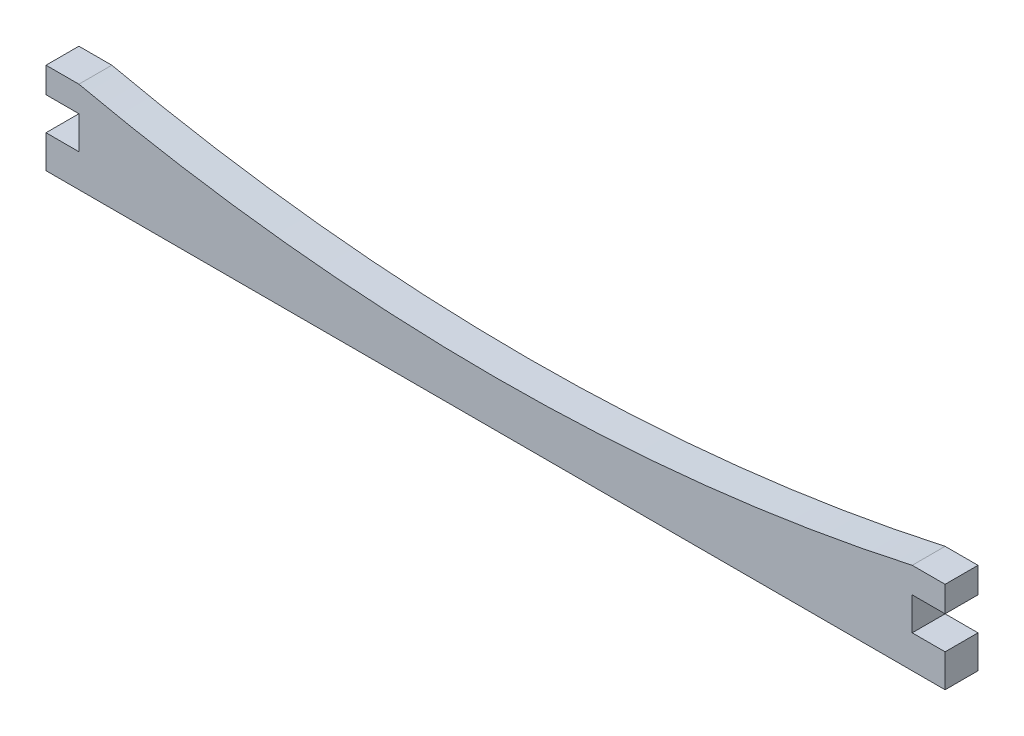
ISO-10303-21;
HEADER;
FILE_DESCRIPTION(('STEP AP214'),'2;1');
FILE_NAME('part.step','',(''),(''),'','','');
FILE_SCHEMA(('AUTOMOTIVE_DESIGN { 1 0 10303 214 1 1 1 1 }'));
ENDSEC;
DATA;
#1=APPLICATION_CONTEXT('core data for automotive mechanical design processes');
#2=APPLICATION_PROTOCOL_DEFINITION('international standard','automotive_design',2000,#1);
#3=PRODUCT_CONTEXT('',#1,'mechanical');
#4=PRODUCT('Part','Part','',(#3));
#5=PRODUCT_RELATED_PRODUCT_CATEGORY('part','',(#4));
#6=PRODUCT_DEFINITION_FORMATION('','',#4);
#7=PRODUCT_DEFINITION_CONTEXT('part definition',#1,'design');
#8=PRODUCT_DEFINITION('design','',#6,#7);
#9=PRODUCT_DEFINITION_SHAPE('','',#8);
#10=(LENGTH_UNIT() NAMED_UNIT(*) SI_UNIT(.MILLI.,.METRE.));
#11=(NAMED_UNIT(*) PLANE_ANGLE_UNIT() SI_UNIT($,.RADIAN.));
#12=(NAMED_UNIT(*) SI_UNIT($,.STERADIAN.) SOLID_ANGLE_UNIT());
#13=UNCERTAINTY_MEASURE_WITH_UNIT(LENGTH_MEASURE(1.E-05),#10,'distance_accuracy_value','');
#14=(GEOMETRIC_REPRESENTATION_CONTEXT(3) GLOBAL_UNCERTAINTY_ASSIGNED_CONTEXT((#13)) GLOBAL_UNIT_ASSIGNED_CONTEXT((#10,
#11,#12)) REPRESENTATION_CONTEXT('',''));
#15=CARTESIAN_POINT('',(0.,0.,0.));
#16=DIRECTION('',(0.,0.,1.));
#17=DIRECTION('',(1.,0.,0.));
#18=AXIS2_PLACEMENT_3D('',#15,#16,#17);
#19=CARTESIAN_POINT('',(-123.,0.,9.));
#20=DIRECTION('',(-1.,0.,0.));
#21=DIRECTION('',(0.,0.,1.));
#22=AXIS2_PLACEMENT_3D('',#19,#20,#21);
#23=PLANE('',#22);
#24=DIRECTION('',(0.,1.,0.));
#25=VECTOR('',#24,1.);
#26=CARTESIAN_POINT('',(-123.,0.,0.));
#27=LINE('',#26,#25);
#28=CARTESIAN_POINT('',(-123.,18.,0.));
#29=VERTEX_POINT('',#28);
#30=CARTESIAN_POINT('',(-123.,25.,0.));
#31=VERTEX_POINT('',#30);
#32=EDGE_CURVE('E175',#29,#31,#27,.T.);
#33=ORIENTED_EDGE('',*,*,#32,.F.);
#34=DIRECTION('',(0.,0.,-1.));
#35=VECTOR('',#34,1.);
#36=CARTESIAN_POINT('',(-123.,18.,9.));
#37=LINE('',#36,#35);
#38=CARTESIAN_POINT('',(-123.,18.,9.));
#39=VERTEX_POINT('',#38);
#40=EDGE_CURVE('E231',#39,#29,#37,.T.);
#41=ORIENTED_EDGE('',*,*,#40,.F.);
#42=DIRECTION('',(0.,1.,0.));
#43=VECTOR('',#42,1.);
#44=CARTESIAN_POINT('',(-123.,0.,9.));
#45=LINE('',#44,#43);
#46=CARTESIAN_POINT('',(-123.,25.,9.));
#47=VERTEX_POINT('',#46);
#48=EDGE_CURVE('E202',#39,#47,#45,.T.);
#49=ORIENTED_EDGE('',*,*,#48,.T.);
#50=DIRECTION('',(0.,0.,-1.));
#51=VECTOR('',#50,1.);
#52=CARTESIAN_POINT('',(-123.,25.,9.));
#53=LINE('',#52,#51);
#54=EDGE_CURVE('E42',#47,#31,#53,.T.);
#55=ORIENTED_EDGE('',*,*,#54,.T.);
#56=EDGE_LOOP('',(#33,#41,#49,#55));
#57=FACE_BOUND('',#56,.T.);
#58=ADVANCED_FACE('F34',(#57),#23,.T.);
#59=CARTESIAN_POINT('',(-123.,0.,9.));
#60=VERTEX_POINT('',#59);
#61=CARTESIAN_POINT('',(-123.,9.,9.));
#62=VERTEX_POINT('',#61);
#63=EDGE_CURVE('E236',#60,#62,#45,.T.);
#64=ORIENTED_EDGE('',*,*,#63,.T.);
#65=DIRECTION('',(0.,0.,-1.));
#66=VECTOR('',#65,1.);
#67=CARTESIAN_POINT('',(-123.,9.,9.));
#68=LINE('',#67,#66);
#69=CARTESIAN_POINT('',(-123.,9.,0.));
#70=VERTEX_POINT('',#69);
#71=EDGE_CURVE('E228',#62,#70,#68,.T.);
#72=ORIENTED_EDGE('',*,*,#71,.T.);
#73=CARTESIAN_POINT('',(-123.,0.,0.));
#74=VERTEX_POINT('',#73);
#75=EDGE_CURVE('E176',#74,#70,#27,.T.);
#76=ORIENTED_EDGE('',*,*,#75,.F.);
#77=DIRECTION('',(0.,0.,-1.));
#78=VECTOR('',#77,1.);
#79=CARTESIAN_POINT('',(-123.,0.,9.));
#80=LINE('',#79,#78);
#81=EDGE_CURVE('E194',#60,#74,#80,.T.);
#82=ORIENTED_EDGE('',*,*,#81,.F.);
#83=EDGE_LOOP('',(#64,#72,#76,#82));
#84=FACE_BOUND('',#83,.T.);
#85=ADVANCED_FACE('F283',(#84),#23,.T.);
#86=CARTESIAN_POINT('',(123.,0.,9.));
#87=DIRECTION('',(1.,0.,0.));
#88=DIRECTION('',(0.,0.,-1.));
#89=AXIS2_PLACEMENT_3D('',#86,#87,#88);
#90=PLANE('',#89);
#91=DIRECTION('',(0.,-1.,0.));
#92=VECTOR('',#91,1.);
#93=CARTESIAN_POINT('',(123.,0.,9.));
#94=LINE('',#93,#92);
#95=CARTESIAN_POINT('',(123.,25.,9.));
#96=VERTEX_POINT('',#95);
#97=CARTESIAN_POINT('',(123.,18.,9.));
#98=VERTEX_POINT('',#97);
#99=EDGE_CURVE('E153',#96,#98,#94,.T.);
#100=ORIENTED_EDGE('',*,*,#99,.T.);
#101=DIRECTION('',(0.,0.,-1.));
#102=VECTOR('',#101,1.);
#103=CARTESIAN_POINT('',(123.,18.,9.));
#104=LINE('',#103,#102);
#105=CARTESIAN_POINT('',(123.,18.,0.));
#106=VERTEX_POINT('',#105);
#107=EDGE_CURVE('E135',#98,#106,#104,.T.);
#108=ORIENTED_EDGE('',*,*,#107,.T.);
#109=DIRECTION('',(0.,-1.,0.));
#110=VECTOR('',#109,1.);
#111=CARTESIAN_POINT('',(123.,0.,0.));
#112=LINE('',#111,#110);
#113=CARTESIAN_POINT('',(123.,25.,0.));
#114=VERTEX_POINT('',#113);
#115=EDGE_CURVE('E183',#114,#106,#112,.T.);
#116=ORIENTED_EDGE('',*,*,#115,.F.);
#117=DIRECTION('',(0.,0.,-1.));
#118=VECTOR('',#117,1.);
#119=CARTESIAN_POINT('',(123.,25.,9.));
#120=LINE('',#119,#118);
#121=EDGE_CURVE('E159',#96,#114,#120,.T.);
#122=ORIENTED_EDGE('',*,*,#121,.F.);
#123=EDGE_LOOP('',(#100,#108,#116,#122));
#124=FACE_BOUND('',#123,.T.);
#125=ADVANCED_FACE('F158',(#124),#90,.T.);
#126=CARTESIAN_POINT('',(123.,9.,0.));
#127=VERTEX_POINT('',#126);
#128=CARTESIAN_POINT('',(123.,0.,0.));
#129=VERTEX_POINT('',#128);
#130=EDGE_CURVE('E182',#127,#129,#112,.T.);
#131=ORIENTED_EDGE('',*,*,#130,.F.);
#132=DIRECTION('',(0.,0.,-1.));
#133=VECTOR('',#132,1.);
#134=CARTESIAN_POINT('',(123.,9.,9.));
#135=LINE('',#134,#133);
#136=CARTESIAN_POINT('',(123.,9.,9.));
#137=VERTEX_POINT('',#136);
#138=EDGE_CURVE('E57',#137,#127,#135,.T.);
#139=ORIENTED_EDGE('',*,*,#138,.F.);
#140=CARTESIAN_POINT('',(123.,0.,9.));
#141=VERTEX_POINT('',#140);
#142=EDGE_CURVE('E162',#137,#141,#94,.T.);
#143=ORIENTED_EDGE('',*,*,#142,.T.);
#144=DIRECTION('',(0.,0.,-1.));
#145=VECTOR('',#144,1.);
#146=CARTESIAN_POINT('',(123.,0.,9.));
#147=LINE('',#146,#145);
#148=EDGE_CURVE('E191',#141,#129,#147,.T.);
#149=ORIENTED_EDGE('',*,*,#148,.T.);
#150=EDGE_LOOP('',(#131,#139,#143,#149));
#151=FACE_BOUND('',#150,.T.);
#152=ADVANCED_FACE('F250',(#151),#90,.T.);
#153=CARTESIAN_POINT('',(0.,0.,9.));
#154=DIRECTION('',(0.,0.,1.));
#155=DIRECTION('',(1.,0.,0.));
#156=AXIS2_PLACEMENT_3D('',#153,#154,#155);
#157=PLANE('',#156);
#158=DIRECTION('',(0.,-1.,0.));
#159=VECTOR('',#158,1.);
#160=CARTESIAN_POINT('',(114.,18.,9.));
#161=LINE('',#160,#159);
#162=CARTESIAN_POINT('',(114.,18.,9.));
#163=VERTEX_POINT('',#162);
#164=CARTESIAN_POINT('',(114.,9.,9.));
#165=VERTEX_POINT('',#164);
#166=EDGE_CURVE('E155',#163,#165,#161,.T.);
#167=ORIENTED_EDGE('',*,*,#166,.F.);
#168=DIRECTION('',(-1.,0.,0.));
#169=VECTOR('',#168,1.);
#170=CARTESIAN_POINT('',(123.,18.,9.));
#171=LINE('',#170,#169);
#172=EDGE_CURVE('E138',#98,#163,#171,.T.);
#173=ORIENTED_EDGE('',*,*,#172,.F.);
#174=ORIENTED_EDGE('',*,*,#99,.F.);
#175=DIRECTION('',(-1.,0.,0.));
#176=VECTOR('',#175,1.);
#177=CARTESIAN_POINT('',(0.,25.,9.));
#178=LINE('',#177,#176);
#179=CARTESIAN_POINT('',(114.,25.,9.));
#180=VERTEX_POINT('',#179);
#181=EDGE_CURVE('E161',#96,#180,#178,.T.);
#182=ORIENTED_EDGE('',*,*,#181,.T.);
#183=CARTESIAN_POINT('',(0.,538.59,9.));
#184=DIRECTION('',(0.,0.,1.));
#185=DIRECTION('',(1.,0.,0.));
#186=AXIS2_PLACEMENT_3D('',#183,#184,#185);
#187=CIRCLE('',#186,526.09);
#188=CARTESIAN_POINT('',(-114.,25.,9.));
#189=VERTEX_POINT('',#188);
#190=EDGE_CURVE('E188',#189,#180,#187,.T.);
#191=ORIENTED_EDGE('',*,*,#190,.F.);
#192=DIRECTION('',(1.,0.,0.));
#193=VECTOR('',#192,1.);
#194=CARTESIAN_POINT('',(0.,24.9999999999996,9.));
#195=LINE('',#194,#193);
#196=EDGE_CURVE('E235',#47,#189,#195,.T.);
#197=ORIENTED_EDGE('',*,*,#196,.F.);
#198=ORIENTED_EDGE('',*,*,#48,.F.);
#199=DIRECTION('',(-1.,0.,0.));
#200=VECTOR('',#199,1.);
#201=CARTESIAN_POINT('',(-123.,18.,9.));
#202=LINE('',#201,#200);
#203=CARTESIAN_POINT('',(-114.,18.,9.));
#204=VERTEX_POINT('',#203);
#205=EDGE_CURVE('E223',#204,#39,#202,.T.);
#206=ORIENTED_EDGE('',*,*,#205,.F.);
#207=DIRECTION('',(0.,1.,0.));
#208=VECTOR('',#207,1.);
#209=CARTESIAN_POINT('',(-114.,18.,9.));
#210=LINE('',#209,#208);
#211=CARTESIAN_POINT('',(-114.,9.,9.));
#212=VERTEX_POINT('',#211);
#213=EDGE_CURVE('E219',#212,#204,#210,.T.);
#214=ORIENTED_EDGE('',*,*,#213,.F.);
#215=DIRECTION('',(1.,0.,0.));
#216=VECTOR('',#215,1.);
#217=CARTESIAN_POINT('',(-123.,9.,9.));
#218=LINE('',#217,#216);
#219=EDGE_CURVE('E260',#62,#212,#218,.T.);
#220=ORIENTED_EDGE('',*,*,#219,.F.);
#221=ORIENTED_EDGE('',*,*,#63,.F.);
#222=DIRECTION('',(1.,0.,0.));
#223=VECTOR('',#222,1.);
#224=CARTESIAN_POINT('',(0.,0.,9.));
#225=LINE('',#224,#223);
#226=EDGE_CURVE('E166',#60,#141,#225,.T.);
#227=ORIENTED_EDGE('',*,*,#226,.T.);
#228=ORIENTED_EDGE('',*,*,#142,.F.);
#229=DIRECTION('',(1.,0.,0.));
#230=VECTOR('',#229,1.);
#231=CARTESIAN_POINT('',(123.,9.,9.));
#232=LINE('',#231,#230);
#233=EDGE_CURVE('E252',#165,#137,#232,.T.);
#234=ORIENTED_EDGE('',*,*,#233,.F.);
#235=EDGE_LOOP('',(#167,#173,#174,#182,#191,#197,#198,#206,#214,#220,#221,#227,#228,#234));
#236=FACE_BOUND('',#235,.T.);
#237=ADVANCED_FACE('F152',(#236),#157,.T.);
#238=CARTESIAN_POINT('',(0.,0.,0.));
#239=DIRECTION('',(0.,0.,1.));
#240=DIRECTION('',(1.,0.,0.));
#241=AXIS2_PLACEMENT_3D('',#238,#239,#240);
#242=PLANE('',#241);
#243=DIRECTION('',(-1.,0.,0.));
#244=VECTOR('',#243,1.);
#245=CARTESIAN_POINT('',(123.,18.,0.));
#246=LINE('',#245,#244);
#247=CARTESIAN_POINT('',(114.,18.,0.));
#248=VERTEX_POINT('',#247);
#249=EDGE_CURVE('E141',#106,#248,#246,.T.);
#250=ORIENTED_EDGE('',*,*,#249,.T.);
#251=DIRECTION('',(0.,-1.,0.));
#252=VECTOR('',#251,1.);
#253=CARTESIAN_POINT('',(114.,18.,0.));
#254=LINE('',#253,#252);
#255=CARTESIAN_POINT('',(114.,9.,0.));
#256=VERTEX_POINT('',#255);
#257=EDGE_CURVE('E275',#248,#256,#254,.T.);
#258=ORIENTED_EDGE('',*,*,#257,.T.);
#259=DIRECTION('',(1.,0.,0.));
#260=VECTOR('',#259,1.);
#261=CARTESIAN_POINT('',(123.,9.,0.));
#262=LINE('',#261,#260);
#263=EDGE_CURVE('E156',#256,#127,#262,.T.);
#264=ORIENTED_EDGE('',*,*,#263,.T.);
#265=ORIENTED_EDGE('',*,*,#130,.T.);
#266=DIRECTION('',(1.,0.,0.));
#267=VECTOR('',#266,1.);
#268=CARTESIAN_POINT('',(0.,0.,0.));
#269=LINE('',#268,#267);
#270=EDGE_CURVE('E179',#74,#129,#269,.T.);
#271=ORIENTED_EDGE('',*,*,#270,.F.);
#272=ORIENTED_EDGE('',*,*,#75,.T.);
#273=DIRECTION('',(1.,0.,0.));
#274=VECTOR('',#273,1.);
#275=CARTESIAN_POINT('',(-123.,9.,0.));
#276=LINE('',#275,#274);
#277=CARTESIAN_POINT('',(-114.,9.,0.));
#278=VERTEX_POINT('',#277);
#279=EDGE_CURVE('E215',#70,#278,#276,.T.);
#280=ORIENTED_EDGE('',*,*,#279,.T.);
#281=DIRECTION('',(0.,1.,0.));
#282=VECTOR('',#281,1.);
#283=CARTESIAN_POINT('',(-114.,18.,0.));
#284=LINE('',#283,#282);
#285=CARTESIAN_POINT('',(-114.,18.,0.));
#286=VERTEX_POINT('',#285);
#287=EDGE_CURVE('E214',#278,#286,#284,.T.);
#288=ORIENTED_EDGE('',*,*,#287,.T.);
#289=DIRECTION('',(-1.,0.,0.));
#290=VECTOR('',#289,1.);
#291=CARTESIAN_POINT('',(-123.,18.,0.));
#292=LINE('',#291,#290);
#293=EDGE_CURVE('E49',#286,#29,#292,.T.);
#294=ORIENTED_EDGE('',*,*,#293,.T.);
#295=ORIENTED_EDGE('',*,*,#32,.T.);
#296=DIRECTION('',(1.,0.,0.));
#297=VECTOR('',#296,1.);
#298=CARTESIAN_POINT('',(0.,24.9999999999996,0.));
#299=LINE('',#298,#297);
#300=CARTESIAN_POINT('',(-114.,25.,0.));
#301=VERTEX_POINT('',#300);
#302=EDGE_CURVE('E172',#31,#301,#299,.T.);
#303=ORIENTED_EDGE('',*,*,#302,.T.);
#304=CARTESIAN_POINT('',(0.,538.59,0.));
#305=DIRECTION('',(0.,0.,1.));
#306=DIRECTION('',(1.,0.,0.));
#307=AXIS2_PLACEMENT_3D('',#304,#305,#306);
#308=CIRCLE('',#307,526.09);
#309=CARTESIAN_POINT('',(114.,25.,0.));
#310=VERTEX_POINT('',#309);
#311=EDGE_CURVE('E146',#301,#310,#308,.T.);
#312=ORIENTED_EDGE('',*,*,#311,.T.);
#313=DIRECTION('',(-1.,0.,0.));
#314=VECTOR('',#313,1.);
#315=CARTESIAN_POINT('',(0.,25.,0.));
#316=LINE('',#315,#314);
#317=EDGE_CURVE('E185',#114,#310,#316,.T.);
#318=ORIENTED_EDGE('',*,*,#317,.F.);
#319=ORIENTED_EDGE('',*,*,#115,.T.);
#320=EDGE_LOOP('',(#250,#258,#264,#265,#271,#272,#280,#288,#294,#295,#303,#312,#318,#319));
#321=FACE_BOUND('',#320,.T.);
#322=ADVANCED_FACE('F209',(#321),#242,.F.);
#323=CARTESIAN_POINT('',(0.,538.59,9.));
#324=DIRECTION('',(0.,0.,-1.));
#325=DIRECTION('',(-1.,0.,0.));
#326=AXIS2_PLACEMENT_3D('',#323,#324,#325);
#327=CYLINDRICAL_SURFACE('',#326,526.09);
#328=ORIENTED_EDGE('',*,*,#311,.F.);
#329=DIRECTION('',(0.,0.,-1.));
#330=VECTOR('',#329,1.);
#331=CARTESIAN_POINT('',(-114.,25.,9.));
#332=LINE('',#331,#330);
#333=EDGE_CURVE('E11',#189,#301,#332,.T.);
#334=ORIENTED_EDGE('',*,*,#333,.F.);
#335=ORIENTED_EDGE('',*,*,#190,.T.);
#336=DIRECTION('',(0.,0.,-1.));
#337=VECTOR('',#336,1.);
#338=CARTESIAN_POINT('',(114.,25.,9.));
#339=LINE('',#338,#337);
#340=EDGE_CURVE('E164',#180,#310,#339,.T.);
#341=ORIENTED_EDGE('',*,*,#340,.T.);
#342=EDGE_LOOP('',(#328,#334,#335,#341));
#343=FACE_BOUND('',#342,.T.);
#344=ADVANCED_FACE('F36',(#343),#327,.F.);
#345=CARTESIAN_POINT('',(0.,24.9999999999996,9.));
#346=DIRECTION('',(0.,1.,0.));
#347=DIRECTION('',(-1.,0.,0.));
#348=AXIS2_PLACEMENT_3D('',#345,#346,#347);
#349=PLANE('',#348);
#350=ORIENTED_EDGE('',*,*,#302,.F.);
#351=ORIENTED_EDGE('',*,*,#54,.F.);
#352=ORIENTED_EDGE('',*,*,#196,.T.);
#353=ORIENTED_EDGE('',*,*,#333,.T.);
#354=EDGE_LOOP('',(#350,#351,#352,#353));
#355=FACE_BOUND('',#354,.T.);
#356=ADVANCED_FACE('F206',(#355),#349,.T.);
#357=CARTESIAN_POINT('',(0.,0.,9.));
#358=DIRECTION('',(0.,1.,0.));
#359=DIRECTION('',(0.,0.,1.));
#360=AXIS2_PLACEMENT_3D('',#357,#358,#359);
#361=PLANE('',#360);
#362=ORIENTED_EDGE('',*,*,#270,.T.);
#363=ORIENTED_EDGE('',*,*,#148,.F.);
#364=ORIENTED_EDGE('',*,*,#226,.F.);
#365=ORIENTED_EDGE('',*,*,#81,.T.);
#366=EDGE_LOOP('',(#362,#363,#364,#365));
#367=FACE_BOUND('',#366,.T.);
#368=ADVANCED_FACE('F246',(#367),#361,.F.);
#369=CARTESIAN_POINT('',(0.,25.,9.));
#370=DIRECTION('',(0.,-1.,0.));
#371=DIRECTION('',(0.,0.,-1.));
#372=AXIS2_PLACEMENT_3D('',#369,#370,#371);
#373=PLANE('',#372);
#374=ORIENTED_EDGE('',*,*,#317,.T.);
#375=ORIENTED_EDGE('',*,*,#340,.F.);
#376=ORIENTED_EDGE('',*,*,#181,.F.);
#377=ORIENTED_EDGE('',*,*,#121,.T.);
#378=EDGE_LOOP('',(#374,#375,#376,#377));
#379=FACE_BOUND('',#378,.T.);
#380=ADVANCED_FACE('F272',(#379),#373,.F.);
#381=CARTESIAN_POINT('',(-123.,18.,9.));
#382=DIRECTION('',(0.,-1.,0.));
#383=DIRECTION('',(0.,0.,-1.));
#384=AXIS2_PLACEMENT_3D('',#381,#382,#383);
#385=PLANE('',#384);
#386=ORIENTED_EDGE('',*,*,#293,.F.);
#387=DIRECTION('',(0.,0.,-1.));
#388=VECTOR('',#387,1.);
#389=CARTESIAN_POINT('',(-114.,18.,9.));
#390=LINE('',#389,#388);
#391=EDGE_CURVE('E224',#204,#286,#390,.T.);
#392=ORIENTED_EDGE('',*,*,#391,.F.);
#393=ORIENTED_EDGE('',*,*,#205,.T.);
#394=ORIENTED_EDGE('',*,*,#40,.T.);
#395=EDGE_LOOP('',(#386,#392,#393,#394));
#396=FACE_BOUND('',#395,.T.);
#397=ADVANCED_FACE('F267',(#396),#385,.T.);
#398=CARTESIAN_POINT('',(-123.,9.,9.));
#399=DIRECTION('',(0.,1.,0.));
#400=DIRECTION('',(0.,0.,1.));
#401=AXIS2_PLACEMENT_3D('',#398,#399,#400);
#402=PLANE('',#401);
#403=ORIENTED_EDGE('',*,*,#279,.F.);
#404=ORIENTED_EDGE('',*,*,#71,.F.);
#405=ORIENTED_EDGE('',*,*,#219,.T.);
#406=DIRECTION('',(0.,0.,-1.));
#407=VECTOR('',#406,1.);
#408=CARTESIAN_POINT('',(-114.,9.,9.));
#409=LINE('',#408,#407);
#410=EDGE_CURVE('E226',#212,#278,#409,.T.);
#411=ORIENTED_EDGE('',*,*,#410,.T.);
#412=EDGE_LOOP('',(#403,#404,#405,#411));
#413=FACE_BOUND('',#412,.T.);
#414=ADVANCED_FACE('F284',(#413),#402,.T.);
#415=CARTESIAN_POINT('',(-114.,18.,9.));
#416=DIRECTION('',(-1.,0.,0.));
#417=DIRECTION('',(0.,-1.,0.));
#418=AXIS2_PLACEMENT_3D('',#415,#416,#417);
#419=PLANE('',#418);
#420=ORIENTED_EDGE('',*,*,#287,.F.);
#421=ORIENTED_EDGE('',*,*,#410,.F.);
#422=ORIENTED_EDGE('',*,*,#213,.T.);
#423=ORIENTED_EDGE('',*,*,#391,.T.);
#424=EDGE_LOOP('',(#420,#421,#422,#423));
#425=FACE_BOUND('',#424,.T.);
#426=ADVANCED_FACE('F265',(#425),#419,.T.);
#427=CARTESIAN_POINT('',(123.,18.,9.));
#428=DIRECTION('',(0.,-1.,0.));
#429=DIRECTION('',(0.,0.,-1.));
#430=AXIS2_PLACEMENT_3D('',#427,#428,#429);
#431=PLANE('',#430);
#432=ORIENTED_EDGE('',*,*,#249,.F.);
#433=ORIENTED_EDGE('',*,*,#107,.F.);
#434=ORIENTED_EDGE('',*,*,#172,.T.);
#435=DIRECTION('',(0.,0.,-1.));
#436=VECTOR('',#435,1.);
#437=CARTESIAN_POINT('',(114.,18.,9.));
#438=LINE('',#437,#436);
#439=EDGE_CURVE('E147',#163,#248,#438,.T.);
#440=ORIENTED_EDGE('',*,*,#439,.T.);
#441=EDGE_LOOP('',(#432,#433,#434,#440));
#442=FACE_BOUND('',#441,.T.);
#443=ADVANCED_FACE('F137',(#442),#431,.T.);
#444=CARTESIAN_POINT('',(114.,18.,9.));
#445=DIRECTION('',(1.,0.,0.));
#446=DIRECTION('',(0.,1.,0.));
#447=AXIS2_PLACEMENT_3D('',#444,#445,#446);
#448=PLANE('',#447);
#449=ORIENTED_EDGE('',*,*,#257,.F.);
#450=ORIENTED_EDGE('',*,*,#439,.F.);
#451=ORIENTED_EDGE('',*,*,#166,.T.);
#452=DIRECTION('',(0.,0.,-1.));
#453=VECTOR('',#452,1.);
#454=CARTESIAN_POINT('',(114.,9.,9.));
#455=LINE('',#454,#453);
#456=EDGE_CURVE('E251',#165,#256,#455,.T.);
#457=ORIENTED_EDGE('',*,*,#456,.T.);
#458=EDGE_LOOP('',(#449,#450,#451,#457));
#459=FACE_BOUND('',#458,.T.);
#460=ADVANCED_FACE('F280',(#459),#448,.T.);
#461=CARTESIAN_POINT('',(123.,9.,9.));
#462=DIRECTION('',(0.,1.,0.));
#463=DIRECTION('',(0.,0.,1.));
#464=AXIS2_PLACEMENT_3D('',#461,#462,#463);
#465=PLANE('',#464);
#466=ORIENTED_EDGE('',*,*,#263,.F.);
#467=ORIENTED_EDGE('',*,*,#456,.F.);
#468=ORIENTED_EDGE('',*,*,#233,.T.);
#469=ORIENTED_EDGE('',*,*,#138,.T.);
#470=EDGE_LOOP('',(#466,#467,#468,#469));
#471=FACE_BOUND('',#470,.T.);
#472=ADVANCED_FACE('F281',(#471),#465,.T.);
#473=CLOSED_SHELL('',(#58,#85,#125,#152,#237,#322,#344,#356,#368,#380,#397,#414,#426,#443,#460,#472));
#474=MANIFOLD_SOLID_BREP('B2',#473);
#475=ADVANCED_BREP_SHAPE_REPRESENTATION('',(#18,#474),#14);
#476=SHAPE_DEFINITION_REPRESENTATION(#9,#475);
ENDSEC;
END-ISO-10303-21;
